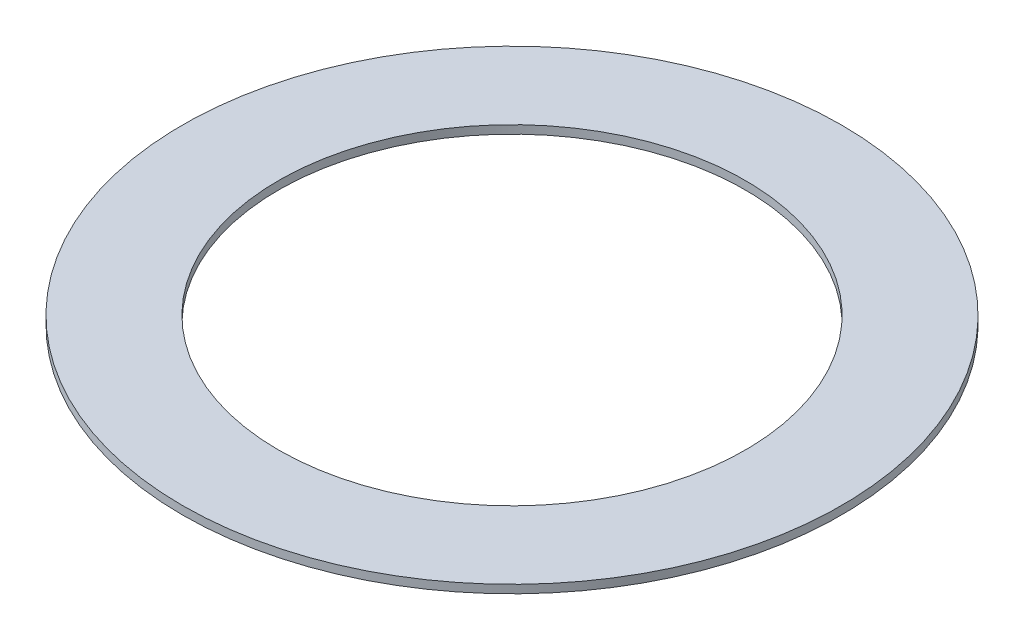
ISO-10303-21;
HEADER;
FILE_DESCRIPTION(('STEP AP214'),'2;1');
FILE_NAME('part.step','',(''),(''),'','','');
FILE_SCHEMA(('AUTOMOTIVE_DESIGN { 1 0 10303 214 1 1 1 1 }'));
ENDSEC;
DATA;
#1=APPLICATION_CONTEXT('core data for automotive mechanical design processes');
#2=APPLICATION_PROTOCOL_DEFINITION('international standard','automotive_design',2000,#1);
#3=PRODUCT_CONTEXT('',#1,'mechanical');
#4=PRODUCT('Part','Part','',(#3));
#5=PRODUCT_RELATED_PRODUCT_CATEGORY('part','',(#4));
#6=PRODUCT_DEFINITION_FORMATION('','',#4);
#7=PRODUCT_DEFINITION_CONTEXT('part definition',#1,'design');
#8=PRODUCT_DEFINITION('design','',#6,#7);
#9=PRODUCT_DEFINITION_SHAPE('','',#8);
#10=(LENGTH_UNIT() NAMED_UNIT(*) SI_UNIT(.MILLI.,.METRE.));
#11=(NAMED_UNIT(*) PLANE_ANGLE_UNIT() SI_UNIT($,.RADIAN.));
#12=(NAMED_UNIT(*) SI_UNIT($,.STERADIAN.) SOLID_ANGLE_UNIT());
#13=UNCERTAINTY_MEASURE_WITH_UNIT(LENGTH_MEASURE(1.E-05),#10,'distance_accuracy_value','');
#14=(GEOMETRIC_REPRESENTATION_CONTEXT(3) GLOBAL_UNCERTAINTY_ASSIGNED_CONTEXT((#13)) GLOBAL_UNIT_ASSIGNED_CONTEXT((#10,
#11,#12)) REPRESENTATION_CONTEXT('',''));
#15=CARTESIAN_POINT('',(0.,0.,0.));
#16=DIRECTION('',(0.,0.,1.));
#17=DIRECTION('',(1.,0.,0.));
#18=AXIS2_PLACEMENT_3D('',#15,#16,#17);
#19=CARTESIAN_POINT('',(0.,0.3,0.));
#20=DIRECTION('',(0.,1.,0.));
#21=DIRECTION('',(0.,0.,1.));
#22=AXIS2_PLACEMENT_3D('',#19,#20,#21);
#23=PLANE('',#22);
#24=CARTESIAN_POINT('',(0.,0.3,0.));
#25=DIRECTION('',(0.,1.,0.));
#26=DIRECTION('',(0.,0.,1.));
#27=AXIS2_PLACEMENT_3D('',#24,#25,#26);
#28=CIRCLE('',#27,12.);
#29=CARTESIAN_POINT('',(0.,0.3,12.));
#30=VERTEX_POINT('',#29);
#31=EDGE_CURVE('E10',#30,#30,#28,.T.);
#32=ORIENTED_EDGE('',*,*,#31,.T.);
#33=EDGE_LOOP('',(#32));
#34=FACE_BOUND('',#33,.T.);
#35=CARTESIAN_POINT('',(0.,0.3,0.));
#36=DIRECTION('',(0.,1.,0.));
#37=DIRECTION('',(0.,0.,1.));
#38=AXIS2_PLACEMENT_3D('',#35,#36,#37);
#39=CIRCLE('',#38,8.5);
#40=CARTESIAN_POINT('',(0.,0.3,8.5));
#41=VERTEX_POINT('',#40);
#42=EDGE_CURVE('E42',#41,#41,#39,.T.);
#43=ORIENTED_EDGE('',*,*,#42,.F.);
#44=EDGE_LOOP('',(#43));
#45=FACE_BOUND('',#44,.T.);
#46=ADVANCED_FACE('F31',(#34,#45),#23,.T.);
#47=CARTESIAN_POINT('',(0.,0.,0.));
#48=DIRECTION('',(0.,1.,0.));
#49=DIRECTION('',(0.,0.,1.));
#50=AXIS2_PLACEMENT_3D('',#47,#48,#49);
#51=PLANE('',#50);
#52=CARTESIAN_POINT('',(0.,0.,0.));
#53=DIRECTION('',(0.,1.,0.));
#54=DIRECTION('',(0.,0.,1.));
#55=AXIS2_PLACEMENT_3D('',#52,#53,#54);
#56=CIRCLE('',#55,12.);
#57=CARTESIAN_POINT('',(0.,0.,12.));
#58=VERTEX_POINT('',#57);
#59=EDGE_CURVE('E35',#58,#58,#56,.T.);
#60=ORIENTED_EDGE('',*,*,#59,.F.);
#61=EDGE_LOOP('',(#60));
#62=FACE_BOUND('',#61,.T.);
#63=CARTESIAN_POINT('',(0.,0.,0.));
#64=DIRECTION('',(0.,1.,0.));
#65=DIRECTION('',(0.,0.,1.));
#66=AXIS2_PLACEMENT_3D('',#63,#64,#65);
#67=CIRCLE('',#66,8.5);
#68=CARTESIAN_POINT('',(0.,0.,8.5));
#69=VERTEX_POINT('',#68);
#70=EDGE_CURVE('E44',#69,#69,#67,.T.);
#71=ORIENTED_EDGE('',*,*,#70,.T.);
#72=EDGE_LOOP('',(#71));
#73=FACE_BOUND('',#72,.T.);
#74=ADVANCED_FACE('F54',(#62,#73),#51,.F.);
#75=CARTESIAN_POINT('',(0.,0.3,0.));
#76=DIRECTION('',(0.,-1.,0.));
#77=DIRECTION('',(0.,0.,-1.));
#78=AXIS2_PLACEMENT_3D('',#75,#76,#77);
#79=CYLINDRICAL_SURFACE('',#78,12.);
#80=ORIENTED_EDGE('',*,*,#31,.F.);
#81=EDGE_LOOP('',(#80));
#82=FACE_BOUND('',#81,.T.);
#83=ORIENTED_EDGE('',*,*,#59,.T.);
#84=EDGE_LOOP('',(#83));
#85=FACE_BOUND('',#84,.T.);
#86=ADVANCED_FACE('F33',(#82,#85),#79,.T.);
#87=CARTESIAN_POINT('',(0.,0.3,0.));
#88=DIRECTION('',(0.,-1.,0.));
#89=DIRECTION('',(0.,0.,-1.));
#90=AXIS2_PLACEMENT_3D('',#87,#88,#89);
#91=CYLINDRICAL_SURFACE('',#90,8.5);
#92=ORIENTED_EDGE('',*,*,#42,.T.);
#93=EDGE_LOOP('',(#92));
#94=FACE_BOUND('',#93,.T.);
#95=ORIENTED_EDGE('',*,*,#70,.F.);
#96=EDGE_LOOP('',(#95));
#97=FACE_BOUND('',#96,.T.);
#98=ADVANCED_FACE('F50',(#94,#97),#91,.F.);
#99=CLOSED_SHELL('',(#46,#74,#86,#98));
#100=MANIFOLD_SOLID_BREP('B2',#99);
#101=ADVANCED_BREP_SHAPE_REPRESENTATION('',(#18,#100),#14);
#102=SHAPE_DEFINITION_REPRESENTATION(#9,#101);
ENDSEC;
END-ISO-10303-21;
